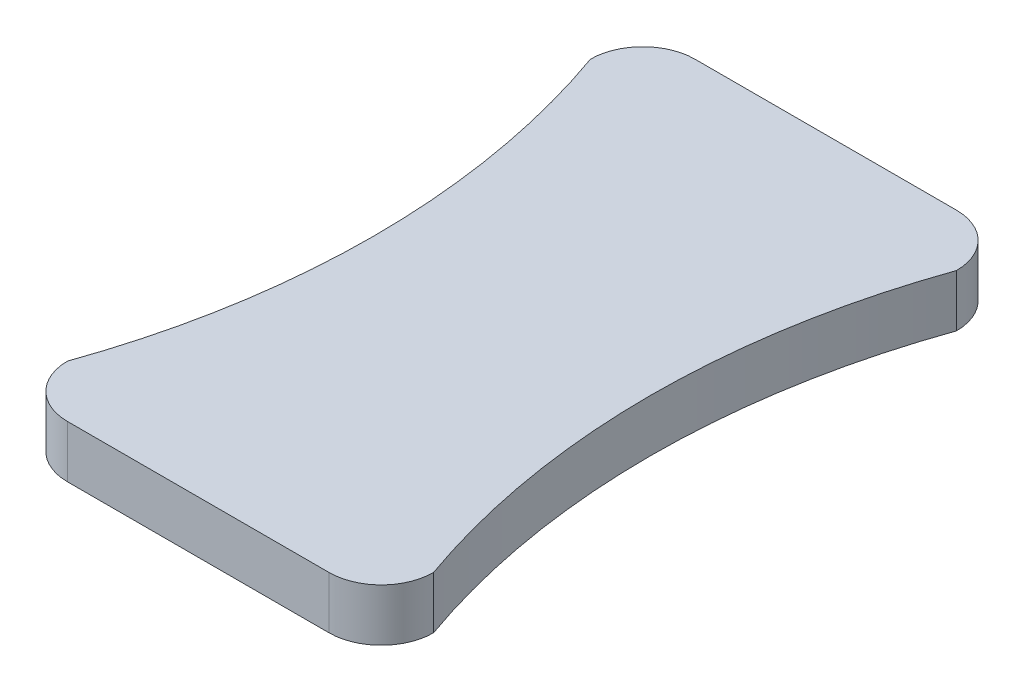
ISO-10303-21;
HEADER;
FILE_DESCRIPTION(('STEP AP214'),'2;1');
FILE_NAME('part.step','',(''),(''),'','','');
FILE_SCHEMA(('AUTOMOTIVE_DESIGN { 1 0 10303 214 1 1 1 1 }'));
ENDSEC;
DATA;
#1=APPLICATION_CONTEXT('core data for automotive mechanical design processes');
#2=APPLICATION_PROTOCOL_DEFINITION('international standard','automotive_design',2000,#1);
#3=PRODUCT_CONTEXT('',#1,'mechanical');
#4=PRODUCT('Part','Part','',(#3));
#5=PRODUCT_RELATED_PRODUCT_CATEGORY('part','',(#4));
#6=PRODUCT_DEFINITION_FORMATION('','',#4);
#7=PRODUCT_DEFINITION_CONTEXT('part definition',#1,'design');
#8=PRODUCT_DEFINITION('design','',#6,#7);
#9=PRODUCT_DEFINITION_SHAPE('','',#8);
#10=(LENGTH_UNIT() NAMED_UNIT(*) SI_UNIT(.MILLI.,.METRE.));
#11=(NAMED_UNIT(*) PLANE_ANGLE_UNIT() SI_UNIT($,.RADIAN.));
#12=(NAMED_UNIT(*) SI_UNIT($,.STERADIAN.) SOLID_ANGLE_UNIT());
#13=UNCERTAINTY_MEASURE_WITH_UNIT(LENGTH_MEASURE(1.E-05),#10,'distance_accuracy_value','');
#14=(GEOMETRIC_REPRESENTATION_CONTEXT(3) GLOBAL_UNCERTAINTY_ASSIGNED_CONTEXT((#13)) GLOBAL_UNIT_ASSIGNED_CONTEXT((#10,
#11,#12)) REPRESENTATION_CONTEXT('',''));
#15=CARTESIAN_POINT('',(0.,0.,0.));
#16=DIRECTION('',(0.,0.,1.));
#17=DIRECTION('',(1.,0.,0.));
#18=AXIS2_PLACEMENT_3D('',#15,#16,#17);
#19=CARTESIAN_POINT('',(-25.,10.,50.));
#20=DIRECTION('',(0.,-1.,0.));
#21=DIRECTION('',(0.,0.,-1.));
#22=AXIS2_PLACEMENT_3D('',#19,#20,#21);
#23=CYLINDRICAL_SURFACE('',#22,10.);
#24=CARTESIAN_POINT('',(-25.,0.,50.));
#25=DIRECTION('',(0.,1.,0.));
#26=DIRECTION('',(0.,0.,-1.));
#27=AXIS2_PLACEMENT_3D('',#24,#25,#26);
#28=CIRCLE('',#27,10.);
#29=CARTESIAN_POINT('',(-35.,0.,49.9999999999999));
#30=VERTEX_POINT('',#29);
#31=CARTESIAN_POINT('',(-24.9999999999999,0.,60.));
#32=VERTEX_POINT('',#31);
#33=EDGE_CURVE('E131',#30,#32,#28,.T.);
#34=ORIENTED_EDGE('',*,*,#33,.T.);
#35=DIRECTION('',(0.,-1.,0.));
#36=VECTOR('',#35,1.);
#37=CARTESIAN_POINT('',(-24.9999999999999,10.,60.));
#38=LINE('',#37,#36);
#39=CARTESIAN_POINT('',(-24.9999999999999,10.,60.));
#40=VERTEX_POINT('',#39);
#41=EDGE_CURVE('E11',#40,#32,#38,.T.);
#42=ORIENTED_EDGE('',*,*,#41,.F.);
#43=CARTESIAN_POINT('',(-25.,10.,50.));
#44=DIRECTION('',(0.,1.,0.));
#45=DIRECTION('',(0.,0.,-1.));
#46=AXIS2_PLACEMENT_3D('',#43,#44,#45);
#47=CIRCLE('',#46,10.);
#48=CARTESIAN_POINT('',(-35.,10.,49.9999999999999));
#49=VERTEX_POINT('',#48);
#50=EDGE_CURVE('E145',#49,#40,#47,.T.);
#51=ORIENTED_EDGE('',*,*,#50,.F.);
#52=DIRECTION('',(0.,-1.,0.));
#53=VECTOR('',#52,1.);
#54=CARTESIAN_POINT('',(-35.,10.,49.9999999999999));
#55=LINE('',#54,#53);
#56=EDGE_CURVE('E127',#49,#30,#55,.T.);
#57=ORIENTED_EDGE('',*,*,#56,.T.);
#58=EDGE_LOOP('',(#34,#42,#51,#57));
#59=FACE_BOUND('',#58,.T.);
#60=ADVANCED_FACE('F35',(#59),#23,.T.);
#61=CARTESIAN_POINT('',(-24.9999999999999,10.,60.));
#62=DIRECTION('',(0.,0.,-1.));
#63=DIRECTION('',(-1.,0.,0.));
#64=AXIS2_PLACEMENT_3D('',#61,#62,#63);
#65=PLANE('',#64);
#66=DIRECTION('',(1.,0.,0.));
#67=VECTOR('',#66,1.);
#68=CARTESIAN_POINT('',(-24.9999999999999,0.,60.));
#69=LINE('',#68,#67);
#70=CARTESIAN_POINT('',(25.,0.,60.));
#71=VERTEX_POINT('',#70);
#72=EDGE_CURVE('E134',#32,#71,#69,.T.);
#73=ORIENTED_EDGE('',*,*,#72,.T.);
#74=DIRECTION('',(0.,-1.,0.));
#75=VECTOR('',#74,1.);
#76=CARTESIAN_POINT('',(25.,10.,60.));
#77=LINE('',#76,#75);
#78=CARTESIAN_POINT('',(25.,10.,60.));
#79=VERTEX_POINT('',#78);
#80=EDGE_CURVE('E43',#79,#71,#77,.T.);
#81=ORIENTED_EDGE('',*,*,#80,.F.);
#82=DIRECTION('',(1.,0.,0.));
#83=VECTOR('',#82,1.);
#84=CARTESIAN_POINT('',(-24.9999999999999,10.,60.));
#85=LINE('',#84,#83);
#86=EDGE_CURVE('E94',#40,#79,#85,.T.);
#87=ORIENTED_EDGE('',*,*,#86,.F.);
#88=ORIENTED_EDGE('',*,*,#41,.T.);
#89=EDGE_LOOP('',(#73,#81,#87,#88));
#90=FACE_BOUND('',#89,.T.);
#91=ADVANCED_FACE('F180',(#90),#65,.F.);
#92=CARTESIAN_POINT('',(25.,10.,50.));
#93=DIRECTION('',(0.,-1.,0.));
#94=DIRECTION('',(0.,0.,-1.));
#95=AXIS2_PLACEMENT_3D('',#92,#93,#94);
#96=CYLINDRICAL_SURFACE('',#95,10.);
#97=CARTESIAN_POINT('',(25.,0.,50.));
#98=DIRECTION('',(0.,1.,0.));
#99=DIRECTION('',(0.,0.,1.));
#100=AXIS2_PLACEMENT_3D('',#97,#98,#99);
#101=CIRCLE('',#100,10.);
#102=CARTESIAN_POINT('',(35.,0.,49.9999999999999));
#103=VERTEX_POINT('',#102);
#104=EDGE_CURVE('E136',#71,#103,#101,.T.);
#105=ORIENTED_EDGE('',*,*,#104,.T.);
#106=DIRECTION('',(0.,-1.,0.));
#107=VECTOR('',#106,1.);
#108=CARTESIAN_POINT('',(35.,10.,49.9999999999999));
#109=LINE('',#108,#107);
#110=CARTESIAN_POINT('',(35.,10.,49.9999999999999));
#111=VERTEX_POINT('',#110);
#112=EDGE_CURVE('E152',#111,#103,#109,.T.);
#113=ORIENTED_EDGE('',*,*,#112,.F.);
#114=CARTESIAN_POINT('',(25.,10.,50.));
#115=DIRECTION('',(0.,1.,0.));
#116=DIRECTION('',(0.,0.,1.));
#117=AXIS2_PLACEMENT_3D('',#114,#115,#116);
#118=CIRCLE('',#117,10.);
#119=EDGE_CURVE('E160',#79,#111,#118,.T.);
#120=ORIENTED_EDGE('',*,*,#119,.F.);
#121=ORIENTED_EDGE('',*,*,#80,.T.);
#122=EDGE_LOOP('',(#105,#113,#120,#121));
#123=FACE_BOUND('',#122,.T.);
#124=ADVANCED_FACE('F158',(#123),#96,.T.);
#125=CARTESIAN_POINT('',(176.42135623731,10.,0.));
#126=DIRECTION('',(0.,-1.,0.));
#127=DIRECTION('',(0.,0.,-1.));
#128=AXIS2_PLACEMENT_3D('',#125,#126,#127);
#129=CYLINDRICAL_SURFACE('',#128,150.);
#130=CARTESIAN_POINT('',(176.42135623731,0.,0.));
#131=DIRECTION('',(0.,-1.,0.));
#132=DIRECTION('',(0.,0.,1.));
#133=AXIS2_PLACEMENT_3D('',#130,#131,#132);
#134=CIRCLE('',#133,150.);
#135=CARTESIAN_POINT('',(35.,0.,-49.9999999999999));
#136=VERTEX_POINT('',#135);
#137=EDGE_CURVE('E138',#103,#136,#134,.T.);
#138=ORIENTED_EDGE('',*,*,#137,.T.);
#139=DIRECTION('',(0.,-1.,0.));
#140=VECTOR('',#139,1.);
#141=CARTESIAN_POINT('',(35.,10.,-49.9999999999999));
#142=LINE('',#141,#140);
#143=CARTESIAN_POINT('',(35.,10.,-49.9999999999999));
#144=VERTEX_POINT('',#143);
#145=EDGE_CURVE('E149',#144,#136,#142,.T.);
#146=ORIENTED_EDGE('',*,*,#145,.F.);
#147=CARTESIAN_POINT('',(176.42135623731,10.,0.));
#148=DIRECTION('',(0.,-1.,0.));
#149=DIRECTION('',(0.,0.,1.));
#150=AXIS2_PLACEMENT_3D('',#147,#148,#149);
#151=CIRCLE('',#150,150.);
#152=EDGE_CURVE('E172',#111,#144,#151,.T.);
#153=ORIENTED_EDGE('',*,*,#152,.F.);
#154=ORIENTED_EDGE('',*,*,#112,.T.);
#155=EDGE_LOOP('',(#138,#146,#153,#154));
#156=FACE_BOUND('',#155,.T.);
#157=ADVANCED_FACE('F168',(#156),#129,.F.);
#158=CARTESIAN_POINT('',(25.,10.,-50.));
#159=DIRECTION('',(0.,-1.,0.));
#160=DIRECTION('',(0.,0.,-1.));
#161=AXIS2_PLACEMENT_3D('',#158,#159,#160);
#162=CYLINDRICAL_SURFACE('',#161,10.);
#163=CARTESIAN_POINT('',(25.,0.,-50.));
#164=DIRECTION('',(0.,1.,0.));
#165=DIRECTION('',(0.,0.,1.));
#166=AXIS2_PLACEMENT_3D('',#163,#164,#165);
#167=CIRCLE('',#166,10.);
#168=CARTESIAN_POINT('',(24.9999999999999,0.,-60.));
#169=VERTEX_POINT('',#168);
#170=EDGE_CURVE('E140',#136,#169,#167,.T.);
#171=ORIENTED_EDGE('',*,*,#170,.T.);
#172=DIRECTION('',(0.,-1.,0.));
#173=VECTOR('',#172,1.);
#174=CARTESIAN_POINT('',(24.9999999999999,10.,-60.));
#175=LINE('',#174,#173);
#176=CARTESIAN_POINT('',(24.9999999999999,10.,-60.));
#177=VERTEX_POINT('',#176);
#178=EDGE_CURVE('E122',#177,#169,#175,.T.);
#179=ORIENTED_EDGE('',*,*,#178,.F.);
#180=CARTESIAN_POINT('',(25.,10.,-50.));
#181=DIRECTION('',(0.,1.,0.));
#182=DIRECTION('',(0.,0.,1.));
#183=AXIS2_PLACEMENT_3D('',#180,#181,#182);
#184=CIRCLE('',#183,10.);
#185=EDGE_CURVE('E113',#144,#177,#184,.T.);
#186=ORIENTED_EDGE('',*,*,#185,.F.);
#187=ORIENTED_EDGE('',*,*,#145,.T.);
#188=EDGE_LOOP('',(#171,#179,#186,#187));
#189=FACE_BOUND('',#188,.T.);
#190=ADVANCED_FACE('F171',(#189),#162,.T.);
#191=CARTESIAN_POINT('',(-24.9999999999999,10.,-60.));
#192=DIRECTION('',(0.,0.,1.));
#193=DIRECTION('',(1.,0.,0.));
#194=AXIS2_PLACEMENT_3D('',#191,#192,#193);
#195=PLANE('',#194);
#196=DIRECTION('',(-1.,0.,0.));
#197=VECTOR('',#196,1.);
#198=CARTESIAN_POINT('',(-24.9999999999999,0.,-60.));
#199=LINE('',#198,#197);
#200=CARTESIAN_POINT('',(-24.9999999999999,0.,-60.));
#201=VERTEX_POINT('',#200);
#202=EDGE_CURVE('E121',#169,#201,#199,.T.);
#203=ORIENTED_EDGE('',*,*,#202,.T.);
#204=DIRECTION('',(0.,-1.,0.));
#205=VECTOR('',#204,1.);
#206=CARTESIAN_POINT('',(-24.9999999999999,10.,-60.));
#207=LINE('',#206,#205);
#208=CARTESIAN_POINT('',(-24.9999999999999,10.,-60.));
#209=VERTEX_POINT('',#208);
#210=EDGE_CURVE('E118',#209,#201,#207,.T.);
#211=ORIENTED_EDGE('',*,*,#210,.F.);
#212=DIRECTION('',(-1.,0.,0.));
#213=VECTOR('',#212,1.);
#214=CARTESIAN_POINT('',(-24.9999999999999,10.,-60.));
#215=LINE('',#214,#213);
#216=EDGE_CURVE('E107',#177,#209,#215,.T.);
#217=ORIENTED_EDGE('',*,*,#216,.F.);
#218=ORIENTED_EDGE('',*,*,#178,.T.);
#219=EDGE_LOOP('',(#203,#211,#217,#218));
#220=FACE_BOUND('',#219,.T.);
#221=ADVANCED_FACE('F119',(#220),#195,.F.);
#222=CARTESIAN_POINT('',(-25.,10.,-50.));
#223=DIRECTION('',(0.,-1.,0.));
#224=DIRECTION('',(0.,0.,-1.));
#225=AXIS2_PLACEMENT_3D('',#222,#223,#224);
#226=CYLINDRICAL_SURFACE('',#225,10.);
#227=CARTESIAN_POINT('',(-25.,0.,-50.));
#228=DIRECTION('',(0.,1.,0.));
#229=DIRECTION('',(0.,0.,1.));
#230=AXIS2_PLACEMENT_3D('',#227,#228,#229);
#231=CIRCLE('',#230,10.);
#232=CARTESIAN_POINT('',(-35.,0.,-49.9999999999999));
#233=VERTEX_POINT('',#232);
#234=EDGE_CURVE('E80',#201,#233,#231,.T.);
#235=ORIENTED_EDGE('',*,*,#234,.T.);
#236=DIRECTION('',(0.,-1.,0.));
#237=VECTOR('',#236,1.);
#238=CARTESIAN_POINT('',(-35.,10.,-49.9999999999999));
#239=LINE('',#238,#237);
#240=CARTESIAN_POINT('',(-35.,10.,-49.9999999999999));
#241=VERTEX_POINT('',#240);
#242=EDGE_CURVE('E123',#241,#233,#239,.T.);
#243=ORIENTED_EDGE('',*,*,#242,.F.);
#244=CARTESIAN_POINT('',(-25.,10.,-50.));
#245=DIRECTION('',(0.,1.,0.));
#246=DIRECTION('',(0.,0.,1.));
#247=AXIS2_PLACEMENT_3D('',#244,#245,#246);
#248=CIRCLE('',#247,10.);
#249=EDGE_CURVE('E111',#209,#241,#248,.T.);
#250=ORIENTED_EDGE('',*,*,#249,.F.);
#251=ORIENTED_EDGE('',*,*,#210,.T.);
#252=EDGE_LOOP('',(#235,#243,#250,#251));
#253=FACE_BOUND('',#252,.T.);
#254=ADVANCED_FACE('F125',(#253),#226,.T.);
#255=CARTESIAN_POINT('',(-176.42135623731,10.,0.));
#256=DIRECTION('',(0.,-1.,0.));
#257=DIRECTION('',(0.,0.,-1.));
#258=AXIS2_PLACEMENT_3D('',#255,#256,#257);
#259=CYLINDRICAL_SURFACE('',#258,150.);
#260=CARTESIAN_POINT('',(-176.42135623731,0.,0.));
#261=DIRECTION('',(0.,-1.,0.));
#262=DIRECTION('',(0.,0.,-1.));
#263=AXIS2_PLACEMENT_3D('',#260,#261,#262);
#264=CIRCLE('',#263,150.);
#265=EDGE_CURVE('E86',#233,#30,#264,.T.);
#266=ORIENTED_EDGE('',*,*,#265,.T.);
#267=ORIENTED_EDGE('',*,*,#56,.F.);
#268=CARTESIAN_POINT('',(-176.42135623731,10.,0.));
#269=DIRECTION('',(0.,-1.,0.));
#270=DIRECTION('',(0.,0.,-1.));
#271=AXIS2_PLACEMENT_3D('',#268,#269,#270);
#272=CIRCLE('',#271,150.);
#273=EDGE_CURVE('E51',#241,#49,#272,.T.);
#274=ORIENTED_EDGE('',*,*,#273,.F.);
#275=ORIENTED_EDGE('',*,*,#242,.T.);
#276=EDGE_LOOP('',(#266,#267,#274,#275));
#277=FACE_BOUND('',#276,.T.);
#278=ADVANCED_FACE('F196',(#277),#259,.F.);
#279=CARTESIAN_POINT('',(-25.,10.,50.));
#280=DIRECTION('',(0.,-1.,0.));
#281=DIRECTION('',(0.,0.,-1.));
#282=AXIS2_PLACEMENT_3D('',#279,#280,#281);
#283=PLANE('',#282);
#284=ORIENTED_EDGE('',*,*,#50,.T.);
#285=ORIENTED_EDGE('',*,*,#86,.T.);
#286=ORIENTED_EDGE('',*,*,#119,.T.);
#287=ORIENTED_EDGE('',*,*,#152,.T.);
#288=ORIENTED_EDGE('',*,*,#185,.T.);
#289=ORIENTED_EDGE('',*,*,#216,.T.);
#290=ORIENTED_EDGE('',*,*,#249,.T.);
#291=ORIENTED_EDGE('',*,*,#273,.T.);
#292=EDGE_LOOP('',(#284,#285,#286,#287,#288,#289,#290,#291));
#293=FACE_BOUND('',#292,.T.);
#294=ADVANCED_FACE('F109',(#293),#283,.F.);
#295=CARTESIAN_POINT('',(-25.,0.,50.));
#296=DIRECTION('',(0.,-1.,0.));
#297=DIRECTION('',(0.,0.,-1.));
#298=AXIS2_PLACEMENT_3D('',#295,#296,#297);
#299=PLANE('',#298);
#300=ORIENTED_EDGE('',*,*,#33,.F.);
#301=ORIENTED_EDGE('',*,*,#265,.F.);
#302=ORIENTED_EDGE('',*,*,#234,.F.);
#303=ORIENTED_EDGE('',*,*,#202,.F.);
#304=ORIENTED_EDGE('',*,*,#170,.F.);
#305=ORIENTED_EDGE('',*,*,#137,.F.);
#306=ORIENTED_EDGE('',*,*,#104,.F.);
#307=ORIENTED_EDGE('',*,*,#72,.F.);
#308=EDGE_LOOP('',(#300,#301,#302,#303,#304,#305,#306,#307));
#309=FACE_BOUND('',#308,.T.);
#310=ADVANCED_FACE('F164',(#309),#299,.T.);
#311=CLOSED_SHELL('',(#60,#91,#124,#157,#190,#221,#254,#278,#294,#310));
#312=MANIFOLD_SOLID_BREP('B2',#311);
#313=ADVANCED_BREP_SHAPE_REPRESENTATION('',(#18,#312),#14);
#314=SHAPE_DEFINITION_REPRESENTATION(#9,#313);
ENDSEC;
END-ISO-10303-21;
